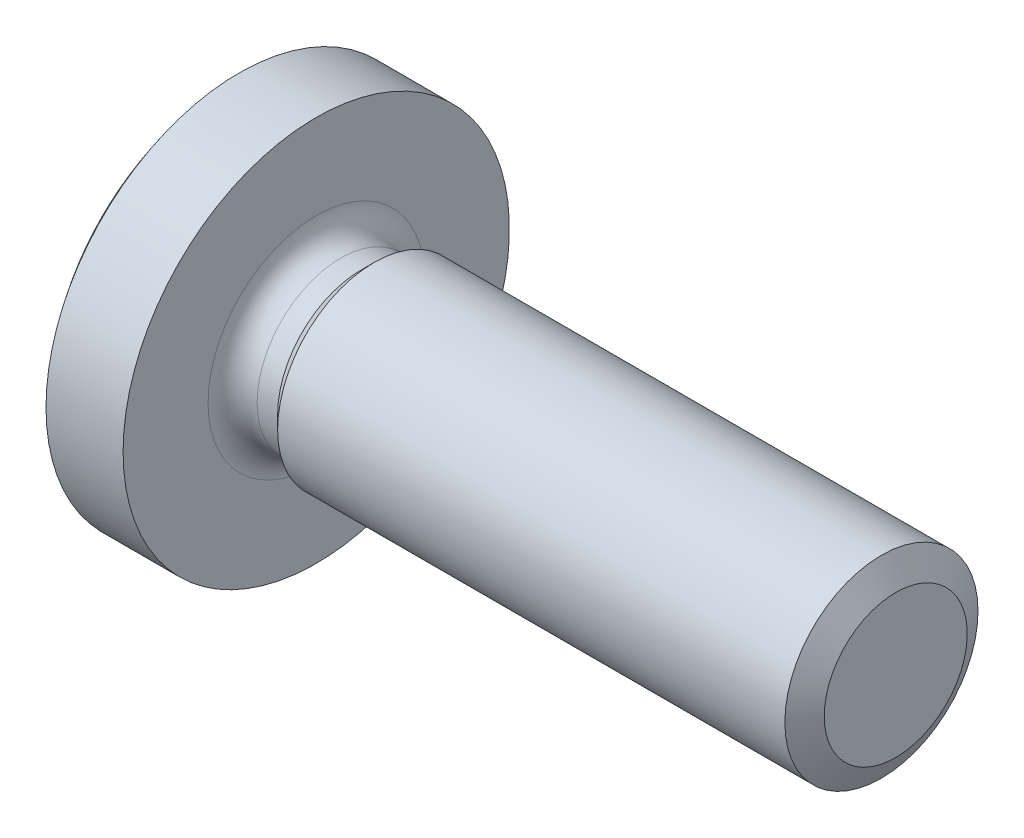
ISO-10303-21;
HEADER;
FILE_DESCRIPTION(('STEP AP214'),'2;1');
FILE_NAME('part.step','',(''),(''),'','','');
FILE_SCHEMA(('AUTOMOTIVE_DESIGN { 1 0 10303 214 1 1 1 1 }'));
ENDSEC;
DATA;
#1=APPLICATION_CONTEXT('core data for automotive mechanical design processes');
#2=APPLICATION_PROTOCOL_DEFINITION('international standard','automotive_design',2000,#1);
#3=PRODUCT_CONTEXT('',#1,'mechanical');
#4=PRODUCT('Part','Part','',(#3));
#5=PRODUCT_RELATED_PRODUCT_CATEGORY('part','',(#4));
#6=PRODUCT_DEFINITION_FORMATION('','',#4);
#7=PRODUCT_DEFINITION_CONTEXT('part definition',#1,'design');
#8=PRODUCT_DEFINITION('design','',#6,#7);
#9=PRODUCT_DEFINITION_SHAPE('','',#8);
#10=(LENGTH_UNIT() NAMED_UNIT(*) SI_UNIT(.MILLI.,.METRE.));
#11=(NAMED_UNIT(*) PLANE_ANGLE_UNIT() SI_UNIT($,.RADIAN.));
#12=(NAMED_UNIT(*) SI_UNIT($,.STERADIAN.) SOLID_ANGLE_UNIT());
#13=UNCERTAINTY_MEASURE_WITH_UNIT(LENGTH_MEASURE(1.E-05),#10,'distance_accuracy_value','');
#14=(GEOMETRIC_REPRESENTATION_CONTEXT(3) GLOBAL_UNCERTAINTY_ASSIGNED_CONTEXT((#13)) GLOBAL_UNIT_ASSIGNED_CONTEXT((#10,
#11,#12)) REPRESENTATION_CONTEXT('',''));
#15=CARTESIAN_POINT('',(0.,0.,0.));
#16=DIRECTION('',(0.,0.,1.));
#17=DIRECTION('',(1.,0.,0.));
#18=AXIS2_PLACEMENT_3D('',#15,#16,#17);
#19=CARTESIAN_POINT('',(5.8,0.,0.));
#20=DIRECTION('',(0.128242606866517,0.,-0.991742826434394));
#21=DIRECTION('',(-0.991742826434394,0.,-0.128242606866517));
#22=AXIS2_PLACEMENT_3D('',#19,#20,#21);
#23=PLANE('',#22);
#24=DIRECTION('',(-0.750624338855488,-0.653560846762105,-0.097063492093382));
#25=VECTOR('',#24,1.);
#26=CARTESIAN_POINT('',(5.8,0.,0.));
#27=LINE('',#26,#25);
#28=CARTESIAN_POINT('',(5.8,0.,0.));
#29=VERTEX_POINT('',#28);
#30=CARTESIAN_POINT('',(0.654465858513344,-4.4801633473289,-0.665370794157758));
#31=VERTEX_POINT('',#30);
#32=EDGE_CURVE('E160',#29,#31,#27,.T.);
#33=ORIENTED_EDGE('',*,*,#32,.F.);
#34=DIRECTION('',(-0.983686874814854,-0.127200888984679,-0.127200888984679));
#35=VECTOR('',#34,1.);
#36=CARTESIAN_POINT('',(5.8,0.,0.));
#37=LINE('',#36,#35);
#38=CARTESIAN_POINT('',(0.0347737449190172,-0.745503395053573,-0.745503395053575));
#39=VERTEX_POINT('',#38);
#40=EDGE_CURVE('E121',#29,#39,#37,.T.);
#41=ORIENTED_EDGE('',*,*,#40,.T.);
#42=CARTESIAN_POINT('',(15.8322491045976,0.,1.29727359111176));
#43=DIRECTION('',(0.128242606866517,0.,-0.991742826434394));
#44=DIRECTION('',(-0.991742826434394,0.,-0.128242606866517));
#45=AXIS2_PLACEMENT_3D('',#42,#43,#44);
#46=CIRCLE('',#45,15.9464397552211);
#47=EDGE_CURVE('E134',#31,#39,#46,.T.);
#48=ORIENTED_EDGE('',*,*,#47,.F.);
#49=EDGE_LOOP('',(#33,#41,#48));
#50=FACE_BOUND('',#49,.T.);
#51=ADVANCED_FACE('F41',(#50),#23,.F.);
#52=CARTESIAN_POINT('',(5.8,0.,0.));
#53=DIRECTION('',(0.128242606866516,0.,0.991742826434394));
#54=DIRECTION('',(0.991742826434394,0.,-0.128242606866516));
#55=AXIS2_PLACEMENT_3D('',#52,#53,#54);
#56=PLANE('',#55);
#57=CARTESIAN_POINT('',(15.8322491045976,0.,-1.29727359111176));
#58=DIRECTION('',(0.128242606866516,0.,0.991742826434394));
#59=DIRECTION('',(0.991742826434394,0.,-0.128242606866516));
#60=AXIS2_PLACEMENT_3D('',#57,#58,#59);
#61=CIRCLE('',#60,15.9464397552211);
#62=CARTESIAN_POINT('',(0.0347737449190172,-0.745503395053578,0.745503395053575));
#63=VERTEX_POINT('',#62);
#64=CARTESIAN_POINT('',(0.654465858513345,-4.4801633473289,0.665370794157757));
#65=VERTEX_POINT('',#64);
#66=EDGE_CURVE('E64',#63,#65,#61,.T.);
#67=ORIENTED_EDGE('',*,*,#66,.F.);
#68=DIRECTION('',(0.983686874814854,0.12720088898468,-0.127200888984679));
#69=VECTOR('',#68,1.);
#70=CARTESIAN_POINT('',(5.8,0.,0.));
#71=LINE('',#70,#69);
#72=EDGE_CURVE('E11',#63,#29,#71,.T.);
#73=ORIENTED_EDGE('',*,*,#72,.T.);
#74=DIRECTION('',(-0.750624338855488,-0.653560846762105,0.097063492093382));
#75=VECTOR('',#74,1.);
#76=CARTESIAN_POINT('',(5.8,0.,0.));
#77=LINE('',#76,#75);
#78=EDGE_CURVE('E161',#29,#65,#77,.T.);
#79=ORIENTED_EDGE('',*,*,#78,.T.);
#80=EDGE_LOOP('',(#67,#73,#79));
#81=FACE_BOUND('',#80,.T.);
#82=ADVANCED_FACE('F176',(#81),#56,.F.);
#83=CARTESIAN_POINT('',(-1.33175770411172,0.,0.));
#84=DIRECTION('',(-1.,0.,0.));
#85=DIRECTION('',(0.,0.,1.));
#86=AXIS2_PLACEMENT_3D('',#83,#84,#85);
#87=CYLINDRICAL_SURFACE('',#86,5.);
#88=CARTESIAN_POINT('',(10.5,0.,0.));
#89=DIRECTION('',(-1.,0.,0.));
#90=DIRECTION('',(0.,0.,1.));
#91=AXIS2_PLACEMENT_3D('',#88,#89,#90);
#92=CIRCLE('',#91,5.);
#93=CARTESIAN_POINT('',(10.5,0.,5.));
#94=VERTEX_POINT('',#93);
#95=EDGE_CURVE('E197',#94,#94,#92,.T.);
#96=ORIENTED_EDGE('',*,*,#95,.F.);
#97=EDGE_LOOP('',(#96));
#98=FACE_BOUND('',#97,.T.);
#99=CARTESIAN_POINT('',(36.7581240086166,0.,0.));
#100=DIRECTION('',(-1.,0.,0.));
#101=DIRECTION('',(0.,0.,1.));
#102=AXIS2_PLACEMENT_3D('',#99,#100,#101);
#103=CIRCLE('',#102,4.99999999999999);
#104=CARTESIAN_POINT('',(36.7581240086166,0.,4.99999999999999));
#105=VERTEX_POINT('',#104);
#106=EDGE_CURVE('E194',#105,#105,#103,.T.);
#107=ORIENTED_EDGE('',*,*,#106,.T.);
#108=EDGE_LOOP('',(#107));
#109=FACE_BOUND('',#108,.T.);
#110=ADVANCED_FACE('F241',(#98,#109),#87,.T.);
#111=CARTESIAN_POINT('',(16.,0.,0.));
#112=DIRECTION('',(-1.,0.,0.));
#113=DIRECTION('',(0.,1.,0.));
#114=AXIS2_PLACEMENT_3D('',#111,#112,#113);
#115=SPHERICAL_SURFACE('',#114,16.);
#116=CARTESIAN_POINT('',(11.6017161939384,0.,-5.05149427230841));
#117=DIRECTION('',(0.656661476494491,0.,0.754185458152088));
#118=DIRECTION('',(0.754185458152088,0.,-0.656661476494491));
#119=AXIS2_PLACEMENT_3D('',#116,#117,#118);
#120=CIRCLE('',#119,14.5305713988876);
#121=CARTESIAN_POINT('',(0.654465858513345,0.665370794157741,4.4801633473289));
#122=VERTEX_POINT('',#121);
#123=CARTESIAN_POINT('',(0.654465858513344,-0.665370794157773,4.4801633473289));
#124=VERTEX_POINT('',#123);
#125=EDGE_CURVE('E127',#122,#124,#120,.T.);
#126=ORIENTED_EDGE('',*,*,#125,.T.);
#127=CARTESIAN_POINT('',(15.8322491045976,1.29727359111176,0.));
#128=DIRECTION('',(0.128242606866517,-0.991742826434394,0.));
#129=DIRECTION('',(0.991742826434394,0.128242606866517,0.));
#130=AXIS2_PLACEMENT_3D('',#127,#128,#129);
#131=CIRCLE('',#130,15.9464397552211);
#132=EDGE_CURVE('E143',#124,#63,#131,.T.);
#133=ORIENTED_EDGE('',*,*,#132,.T.);
#134=ORIENTED_EDGE('',*,*,#66,.T.);
#135=CARTESIAN_POINT('',(11.6017161939384,5.05149427230841,0.));
#136=DIRECTION('',(0.656661476494491,-0.754185458152088,0.));
#137=DIRECTION('',(0.754185458152088,0.656661476494491,0.));
#138=AXIS2_PLACEMENT_3D('',#135,#136,#137);
#139=CIRCLE('',#138,14.5305713988876);
#140=EDGE_CURVE('E173',#65,#31,#139,.T.);
#141=ORIENTED_EDGE('',*,*,#140,.T.);
#142=ORIENTED_EDGE('',*,*,#47,.T.);
#143=CARTESIAN_POINT('',(0.654465858513344,-0.665370794157742,-4.4801633473289));
#144=VERTEX_POINT('',#143);
#145=EDGE_CURVE('E123',#39,#144,#131,.T.);
#146=ORIENTED_EDGE('',*,*,#145,.T.);
#147=CARTESIAN_POINT('',(11.6017161939384,0.,5.05149427230841));
#148=DIRECTION('',(0.656661476494491,0.,-0.754185458152088));
#149=DIRECTION('',(-0.754185458152088,0.,-0.656661476494491));
#150=AXIS2_PLACEMENT_3D('',#147,#148,#149);
#151=CIRCLE('',#150,14.5305713988876);
#152=CARTESIAN_POINT('',(0.654465858513345,0.665370794157772,-4.4801633473289));
#153=VERTEX_POINT('',#152);
#154=EDGE_CURVE('E115',#144,#153,#151,.T.);
#155=ORIENTED_EDGE('',*,*,#154,.T.);
#156=CARTESIAN_POINT('',(15.8322491045976,-1.29727359111176,0.));
#157=DIRECTION('',(0.128242606866516,0.991742826434394,0.));
#158=DIRECTION('',(-0.991742826434394,0.128242606866516,0.));
#159=AXIS2_PLACEMENT_3D('',#156,#157,#158);
#160=CIRCLE('',#159,15.9464397552211);
#161=CARTESIAN_POINT('',(0.0347737449190172,0.745503395053578,-0.745503395053575));
#162=VERTEX_POINT('',#161);
#163=EDGE_CURVE('E106',#153,#162,#160,.T.);
#164=ORIENTED_EDGE('',*,*,#163,.T.);
#165=CARTESIAN_POINT('',(0.654465858513344,4.4801633473289,-0.665370794157758));
#166=VERTEX_POINT('',#165);
#167=EDGE_CURVE('E151',#162,#166,#46,.T.);
#168=ORIENTED_EDGE('',*,*,#167,.T.);
#169=CARTESIAN_POINT('',(11.6017161939384,-5.05149427230841,0.));
#170=DIRECTION('',(0.656661476494491,0.754185458152088,0.));
#171=DIRECTION('',(-0.754185458152088,0.656661476494491,0.));
#172=AXIS2_PLACEMENT_3D('',#169,#170,#171);
#173=CIRCLE('',#172,14.5305713988876);
#174=CARTESIAN_POINT('',(0.654465858513345,4.4801633473289,0.665370794157757));
#175=VERTEX_POINT('',#174);
#176=EDGE_CURVE('E164',#166,#175,#173,.T.);
#177=ORIENTED_EDGE('',*,*,#176,.T.);
#178=CARTESIAN_POINT('',(0.0347737449190172,0.745503395053572,0.745503395053575));
#179=VERTEX_POINT('',#178);
#180=EDGE_CURVE('E156',#175,#179,#61,.T.);
#181=ORIENTED_EDGE('',*,*,#180,.T.);
#182=EDGE_CURVE('E56',#179,#122,#160,.T.);
#183=ORIENTED_EDGE('',*,*,#182,.T.);
#184=EDGE_LOOP('',(#126,#133,#134,#141,#142,#146,#155,#164,#168,#177,#181,#183));
#185=FACE_BOUND('',#184,.T.);
#186=CARTESIAN_POINT('',(3.51000400320321,0.,0.));
#187=DIRECTION('',(-1.,0.,0.));
#188=DIRECTION('',(0.,0.,1.));
#189=AXIS2_PLACEMENT_3D('',#186,#187,#188);
#190=CIRCLE('',#189,10.);
#191=CARTESIAN_POINT('',(3.51000400320321,0.,10.));
#192=VERTEX_POINT('',#191);
#193=EDGE_CURVE('E177',#192,#192,#190,.T.);
#194=ORIENTED_EDGE('',*,*,#193,.T.);
#195=EDGE_LOOP('',(#194));
#196=FACE_BOUND('',#195,.T.);
#197=ADVANCED_FACE('F43',(#185,#196),#115,.T.);
#198=CARTESIAN_POINT('',(-1.33175770411172,0.,0.));
#199=DIRECTION('',(-1.,0.,0.));
#200=DIRECTION('',(0.,0.,1.));
#201=AXIS2_PLACEMENT_3D('',#198,#199,#200);
#202=CYLINDRICAL_SURFACE('',#201,10.);
#203=ORIENTED_EDGE('',*,*,#193,.F.);
#204=EDGE_LOOP('',(#203));
#205=FACE_BOUND('',#204,.T.);
#206=CARTESIAN_POINT('',(7.5,0.,0.));
#207=DIRECTION('',(-1.,0.,0.));
#208=DIRECTION('',(0.,0.,1.));
#209=AXIS2_PLACEMENT_3D('',#206,#207,#208);
#210=CIRCLE('',#209,10.);
#211=CARTESIAN_POINT('',(7.5,0.,10.));
#212=VERTEX_POINT('',#211);
#213=EDGE_CURVE('E180',#212,#212,#210,.T.);
#214=ORIENTED_EDGE('',*,*,#213,.T.);
#215=EDGE_LOOP('',(#214));
#216=FACE_BOUND('',#215,.T.);
#217=ADVANCED_FACE('F214',(#205,#216),#202,.T.);
#218=CARTESIAN_POINT('',(7.5,5.6,0.));
#219=DIRECTION('',(-1.,0.,0.));
#220=DIRECTION('',(0.,0.,1.));
#221=AXIS2_PLACEMENT_3D('',#218,#219,#220);
#222=PLANE('',#221);
#223=ORIENTED_EDGE('',*,*,#213,.F.);
#224=EDGE_LOOP('',(#223));
#225=FACE_BOUND('',#224,.T.);
#226=CARTESIAN_POINT('',(7.5,0.,0.));
#227=DIRECTION('',(-1.,0.,0.));
#228=DIRECTION('',(0.,0.,1.));
#229=AXIS2_PLACEMENT_3D('',#226,#227,#228);
#230=CIRCLE('',#229,5.6);
#231=CARTESIAN_POINT('',(7.5,0.,5.6));
#232=VERTEX_POINT('',#231);
#233=EDGE_CURVE('E206',#232,#232,#230,.T.);
#234=ORIENTED_EDGE('',*,*,#233,.T.);
#235=EDGE_LOOP('',(#234));
#236=FACE_BOUND('',#235,.T.);
#237=ADVANCED_FACE('F216',(#225,#236),#222,.F.);
#238=CARTESIAN_POINT('',(8.77,0.,0.));
#239=DIRECTION('',(-1.,0.,0.));
#240=DIRECTION('',(0.,0.,1.));
#241=AXIS2_PLACEMENT_3D('',#238,#239,#240);
#242=TOROIDAL_SURFACE('',#241,5.6,1.27);
#243=ORIENTED_EDGE('',*,*,#233,.F.);
#244=EDGE_LOOP('',(#243));
#245=FACE_BOUND('',#244,.T.);
#246=CARTESIAN_POINT('',(8.77,0.,0.));
#247=DIRECTION('',(-1.,0.,0.));
#248=DIRECTION('',(0.,0.,1.));
#249=AXIS2_PLACEMENT_3D('',#246,#247,#248);
#250=CIRCLE('',#249,4.33);
#251=CARTESIAN_POINT('',(8.77,0.,4.33));
#252=VERTEX_POINT('',#251);
#253=EDGE_CURVE('E203',#252,#252,#250,.T.);
#254=ORIENTED_EDGE('',*,*,#253,.T.);
#255=EDGE_LOOP('',(#254));
#256=FACE_BOUND('',#255,.T.);
#257=ADVANCED_FACE('F219',(#245,#256),#242,.F.);
#258=CARTESIAN_POINT('',(-1.33175770411172,0.,0.));
#259=DIRECTION('',(-1.,0.,0.));
#260=DIRECTION('',(0.,0.,1.));
#261=AXIS2_PLACEMENT_3D('',#258,#259,#260);
#262=CYLINDRICAL_SURFACE('',#261,4.33);
#263=ORIENTED_EDGE('',*,*,#253,.F.);
#264=EDGE_LOOP('',(#263));
#265=FACE_BOUND('',#264,.T.);
#266=CARTESIAN_POINT('',(9.82999999999999,0.,0.));
#267=DIRECTION('',(-1.,0.,0.));
#268=DIRECTION('',(0.,0.,1.));
#269=AXIS2_PLACEMENT_3D('',#266,#267,#268);
#270=CIRCLE('',#269,4.33);
#271=CARTESIAN_POINT('',(9.82999999999999,0.,4.33));
#272=VERTEX_POINT('',#271);
#273=EDGE_CURVE('E200',#272,#272,#270,.T.);
#274=ORIENTED_EDGE('',*,*,#273,.T.);
#275=EDGE_LOOP('',(#274));
#276=FACE_BOUND('',#275,.T.);
#277=ADVANCED_FACE('F225',(#265,#276),#262,.T.);
#278=CARTESIAN_POINT('',(10.5,0.,0.));
#279=DIRECTION('',(1.,0.,0.));
#280=DIRECTION('',(0.,0.,-1.));
#281=AXIS2_PLACEMENT_3D('',#278,#279,#280);
#282=CONICAL_SURFACE('',#281,5.,0.785398163397445);
#283=ORIENTED_EDGE('',*,*,#273,.F.);
#284=EDGE_LOOP('',(#283));
#285=FACE_BOUND('',#284,.T.);
#286=ORIENTED_EDGE('',*,*,#95,.T.);
#287=EDGE_LOOP('',(#286));
#288=FACE_BOUND('',#287,.T.);
#289=ADVANCED_FACE('F231',(#285,#288),#282,.T.);
#290=CARTESIAN_POINT('',(36.7581240086166,0.,0.));
#291=DIRECTION('',(-1.,0.,0.));
#292=DIRECTION('',(0.,0.,1.));
#293=AXIS2_PLACEMENT_3D('',#290,#291,#292);
#294=CONICAL_SURFACE('',#293,4.99999999999999,1.05188801855304);
#295=CARTESIAN_POINT('',(37.5,0.,0.));
#296=DIRECTION('',(-1.,0.,0.));
#297=DIRECTION('',(0.,0.,1.));
#298=AXIS2_PLACEMENT_3D('',#295,#296,#297);
#299=CIRCLE('',#298,3.701);
#300=CARTESIAN_POINT('',(37.5,0.,3.701));
#301=VERTEX_POINT('',#300);
#302=EDGE_CURVE('E165',#301,#301,#299,.T.);
#303=ORIENTED_EDGE('',*,*,#302,.T.);
#304=EDGE_LOOP('',(#303));
#305=FACE_BOUND('',#304,.T.);
#306=ORIENTED_EDGE('',*,*,#106,.F.);
#307=EDGE_LOOP('',(#306));
#308=FACE_BOUND('',#307,.T.);
#309=ADVANCED_FACE('F237',(#305,#308),#294,.T.);
#310=CARTESIAN_POINT('',(37.5,0.,0.));
#311=DIRECTION('',(-1.,0.,0.));
#312=DIRECTION('',(0.,0.,1.));
#313=AXIS2_PLACEMENT_3D('',#310,#311,#312);
#314=PLANE('',#313);
#315=ORIENTED_EDGE('',*,*,#302,.F.);
#316=EDGE_LOOP('',(#315));
#317=FACE_BOUND('',#316,.T.);
#318=ADVANCED_FACE('F248',(#317),#314,.F.);
#319=ORIENTED_EDGE('',*,*,#167,.F.);
#320=DIRECTION('',(0.983686874814854,-0.12720088898468,0.127200888984679));
#321=VECTOR('',#320,1.);
#322=CARTESIAN_POINT('',(5.8,0.,0.));
#323=LINE('',#322,#321);
#324=EDGE_CURVE('E104',#162,#29,#323,.T.);
#325=ORIENTED_EDGE('',*,*,#324,.T.);
#326=DIRECTION('',(-0.750624338855488,0.653560846762105,-0.097063492093382));
#327=VECTOR('',#326,1.);
#328=CARTESIAN_POINT('',(5.8,0.,0.));
#329=LINE('',#328,#327);
#330=EDGE_CURVE('E150',#29,#166,#329,.T.);
#331=ORIENTED_EDGE('',*,*,#330,.T.);
#332=EDGE_LOOP('',(#319,#325,#331));
#333=FACE_BOUND('',#332,.T.);
#334=ADVANCED_FACE('F148',(#333),#23,.F.);
#335=CARTESIAN_POINT('',(0.,5.05,-0.75));
#336=DIRECTION('',(0.656661476494491,0.754185458152088,0.));
#337=DIRECTION('',(-0.754185458152088,0.656661476494491,0.));
#338=AXIS2_PLACEMENT_3D('',#335,#336,#337);
#339=PLANE('',#338);
#340=ORIENTED_EDGE('',*,*,#330,.F.);
#341=DIRECTION('',(-0.750624338855488,0.653560846762105,0.097063492093382));
#342=VECTOR('',#341,1.);
#343=CARTESIAN_POINT('',(5.8,0.,0.));
#344=LINE('',#343,#342);
#345=EDGE_CURVE('E154',#29,#175,#344,.T.);
#346=ORIENTED_EDGE('',*,*,#345,.T.);
#347=ORIENTED_EDGE('',*,*,#176,.F.);
#348=EDGE_LOOP('',(#340,#346,#347));
#349=FACE_BOUND('',#348,.T.);
#350=ADVANCED_FACE('F163',(#349),#339,.F.);
#351=CARTESIAN_POINT('',(0.,-5.05,0.75));
#352=DIRECTION('',(0.656661476494491,-0.754185458152088,0.));
#353=DIRECTION('',(0.754185458152088,0.656661476494491,0.));
#354=AXIS2_PLACEMENT_3D('',#351,#352,#353);
#355=PLANE('',#354);
#356=ORIENTED_EDGE('',*,*,#78,.F.);
#357=ORIENTED_EDGE('',*,*,#32,.T.);
#358=ORIENTED_EDGE('',*,*,#140,.F.);
#359=EDGE_LOOP('',(#356,#357,#358));
#360=FACE_BOUND('',#359,.T.);
#361=ADVANCED_FACE('F172',(#360),#355,.F.);
#362=ORIENTED_EDGE('',*,*,#345,.F.);
#363=DIRECTION('',(-0.983686874814854,0.127200888984679,0.127200888984679));
#364=VECTOR('',#363,1.);
#365=CARTESIAN_POINT('',(5.8,0.,0.));
#366=LINE('',#365,#364);
#367=EDGE_CURVE('E49',#29,#179,#366,.T.);
#368=ORIENTED_EDGE('',*,*,#367,.T.);
#369=ORIENTED_EDGE('',*,*,#180,.F.);
#370=EDGE_LOOP('',(#362,#368,#369));
#371=FACE_BOUND('',#370,.T.);
#372=ADVANCED_FACE('F155',(#371),#56,.F.);
#373=CARTESIAN_POINT('',(5.8,0.,0.));
#374=DIRECTION('',(0.128242606866517,-0.991742826434394,0.));
#375=DIRECTION('',(-0.991742826434394,-0.128242606866517,0.));
#376=AXIS2_PLACEMENT_3D('',#373,#374,#375);
#377=PLANE('',#376);
#378=DIRECTION('',(-0.750624338855488,-0.0970634920933844,0.653560846762105));
#379=VECTOR('',#378,1.);
#380=CARTESIAN_POINT('',(5.8,0.,0.));
#381=LINE('',#380,#379);
#382=EDGE_CURVE('E118',#29,#124,#381,.T.);
#383=ORIENTED_EDGE('',*,*,#382,.F.);
#384=ORIENTED_EDGE('',*,*,#72,.F.);
#385=ORIENTED_EDGE('',*,*,#132,.F.);
#386=EDGE_LOOP('',(#383,#384,#385));
#387=FACE_BOUND('',#386,.T.);
#388=ADVANCED_FACE('F142',(#387),#377,.F.);
#389=CARTESIAN_POINT('',(5.8,0.,0.));
#390=DIRECTION('',(0.128242606866516,0.991742826434394,0.));
#391=DIRECTION('',(0.991742826434394,-0.128242606866516,0.));
#392=AXIS2_PLACEMENT_3D('',#389,#390,#391);
#393=PLANE('',#392);
#394=ORIENTED_EDGE('',*,*,#367,.F.);
#395=DIRECTION('',(-0.750624338855488,0.0970634920933797,0.653560846762106));
#396=VECTOR('',#395,1.);
#397=CARTESIAN_POINT('',(5.8,0.,0.));
#398=LINE('',#397,#396);
#399=EDGE_CURVE('E109',#29,#122,#398,.T.);
#400=ORIENTED_EDGE('',*,*,#399,.T.);
#401=ORIENTED_EDGE('',*,*,#182,.F.);
#402=EDGE_LOOP('',(#394,#400,#401));
#403=FACE_BOUND('',#402,.T.);
#404=ADVANCED_FACE('F130',(#403),#393,.F.);
#405=CARTESIAN_POINT('',(0.,-0.750000000000018,5.05));
#406=DIRECTION('',(0.656661476494491,0.,0.754185458152088));
#407=DIRECTION('',(-0.754185458152088,0.,0.656661476494491));
#408=AXIS2_PLACEMENT_3D('',#405,#406,#407);
#409=PLANE('',#408);
#410=ORIENTED_EDGE('',*,*,#399,.F.);
#411=ORIENTED_EDGE('',*,*,#382,.T.);
#412=ORIENTED_EDGE('',*,*,#125,.F.);
#413=EDGE_LOOP('',(#410,#411,#412));
#414=FACE_BOUND('',#413,.T.);
#415=ADVANCED_FACE('F138',(#414),#409,.F.);
#416=ORIENTED_EDGE('',*,*,#40,.F.);
#417=DIRECTION('',(-0.750624338855488,-0.0970634920933797,-0.653560846762106));
#418=VECTOR('',#417,1.);
#419=CARTESIAN_POINT('',(5.8,0.,0.));
#420=LINE('',#419,#418);
#421=EDGE_CURVE('E112',#29,#144,#420,.T.);
#422=ORIENTED_EDGE('',*,*,#421,.T.);
#423=ORIENTED_EDGE('',*,*,#145,.F.);
#424=EDGE_LOOP('',(#416,#422,#423));
#425=FACE_BOUND('',#424,.T.);
#426=ADVANCED_FACE('F122',(#425),#377,.F.);
#427=CARTESIAN_POINT('',(0.,0.750000000000018,-5.05));
#428=DIRECTION('',(0.656661476494491,0.,-0.754185458152088));
#429=DIRECTION('',(0.754185458152088,0.,0.656661476494491));
#430=AXIS2_PLACEMENT_3D('',#427,#428,#429);
#431=PLANE('',#430);
#432=ORIENTED_EDGE('',*,*,#421,.F.);
#433=DIRECTION('',(-0.750624338855488,0.0970634920933844,-0.653560846762105));
#434=VECTOR('',#433,1.);
#435=CARTESIAN_POINT('',(5.8,0.,0.));
#436=LINE('',#435,#434);
#437=EDGE_CURVE('E100',#29,#153,#436,.T.);
#438=ORIENTED_EDGE('',*,*,#437,.T.);
#439=ORIENTED_EDGE('',*,*,#154,.F.);
#440=EDGE_LOOP('',(#432,#438,#439));
#441=FACE_BOUND('',#440,.T.);
#442=ADVANCED_FACE('F114',(#441),#431,.F.);
#443=ORIENTED_EDGE('',*,*,#437,.F.);
#444=ORIENTED_EDGE('',*,*,#324,.F.);
#445=ORIENTED_EDGE('',*,*,#163,.F.);
#446=EDGE_LOOP('',(#443,#444,#445));
#447=FACE_BOUND('',#446,.T.);
#448=ADVANCED_FACE('F102',(#447),#393,.F.);
#449=CLOSED_SHELL('',(#51,#82,#110,#197,#217,#237,#257,#277,#289,#309,#318,#334,#350,#361,#372,
#388,#404,#415,#426,#442,#448));
#450=MANIFOLD_SOLID_BREP('B2',#449);
#451=ADVANCED_BREP_SHAPE_REPRESENTATION('',(#18,#450),#14);
#452=SHAPE_DEFINITION_REPRESENTATION(#9,#451);
ENDSEC;
END-ISO-10303-21;
